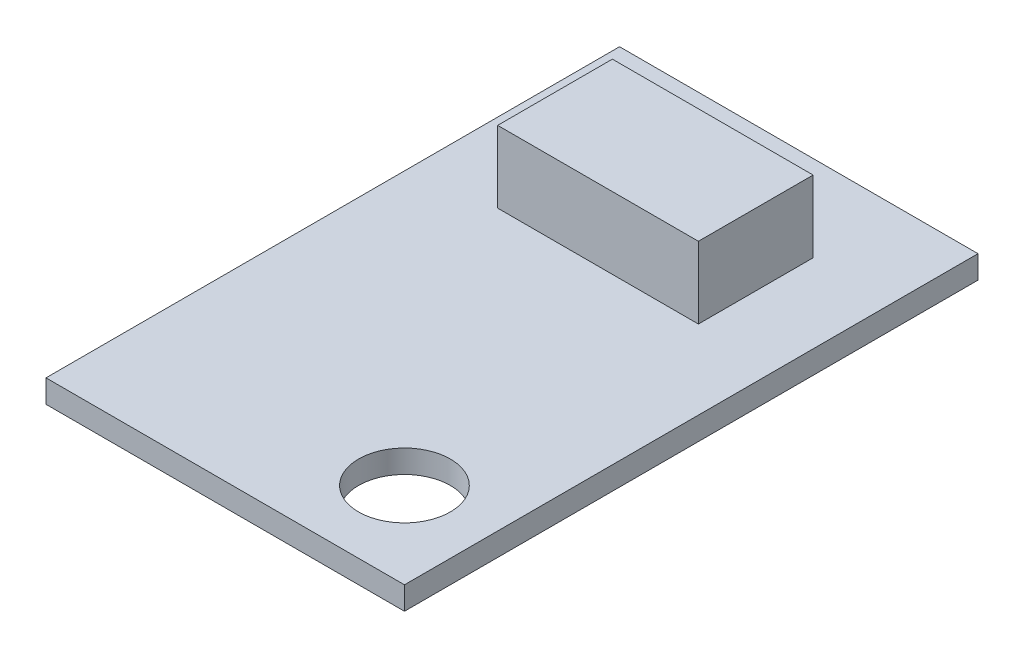
ISO-10303-21;
HEADER;
FILE_DESCRIPTION(('STEP AP214'),'2;1');
FILE_NAME('part.step','',(''),(''),'','','');
FILE_SCHEMA(('AUTOMOTIVE_DESIGN { 1 0 10303 214 1 1 1 1 }'));
ENDSEC;
DATA;
#1=APPLICATION_CONTEXT('core data for automotive mechanical design processes');
#2=APPLICATION_PROTOCOL_DEFINITION('international standard','automotive_design',2000,#1);
#3=PRODUCT_CONTEXT('',#1,'mechanical');
#4=PRODUCT('Part','Part','',(#3));
#5=PRODUCT_RELATED_PRODUCT_CATEGORY('part','',(#4));
#6=PRODUCT_DEFINITION_FORMATION('','',#4);
#7=PRODUCT_DEFINITION_CONTEXT('part definition',#1,'design');
#8=PRODUCT_DEFINITION('design','',#6,#7);
#9=PRODUCT_DEFINITION_SHAPE('','',#8);
#10=(LENGTH_UNIT() NAMED_UNIT(*) SI_UNIT(.MILLI.,.METRE.));
#11=(NAMED_UNIT(*) PLANE_ANGLE_UNIT() SI_UNIT($,.RADIAN.));
#12=(NAMED_UNIT(*) SI_UNIT($,.STERADIAN.) SOLID_ANGLE_UNIT());
#13=UNCERTAINTY_MEASURE_WITH_UNIT(LENGTH_MEASURE(1.E-05),#10,'distance_accuracy_value','');
#14=(GEOMETRIC_REPRESENTATION_CONTEXT(3) GLOBAL_UNCERTAINTY_ASSIGNED_CONTEXT((#13)) GLOBAL_UNIT_ASSIGNED_CONTEXT((#10,
#11,#12)) REPRESENTATION_CONTEXT('',''));
#15=CARTESIAN_POINT('',(0.,0.,0.));
#16=DIRECTION('',(0.,0.,1.));
#17=DIRECTION('',(1.,0.,0.));
#18=AXIS2_PLACEMENT_3D('',#15,#16,#17);
#19=CARTESIAN_POINT('',(0.,0.8,0.));
#20=DIRECTION('',(0.,-1.,0.));
#21=DIRECTION('',(0.,0.,-1.));
#22=AXIS2_PLACEMENT_3D('',#19,#20,#21);
#23=PLANE('',#22);
#24=CARTESIAN_POINT('',(3.25,0.8,-3.));
#25=DIRECTION('',(0.,1.,0.));
#26=DIRECTION('',(0.,0.,1.));
#27=AXIS2_PLACEMENT_3D('',#24,#25,#26);
#28=CIRCLE('',#27,1.6);
#29=CARTESIAN_POINT('',(3.25,0.8,-1.4));
#30=VERTEX_POINT('',#29);
#31=EDGE_CURVE('E124',#30,#30,#28,.T.);
#32=ORIENTED_EDGE('',*,*,#31,.F.);
#33=EDGE_LOOP('',(#32));
#34=FACE_BOUND('',#33,.T.);
#35=DIRECTION('',(0.,0.,1.));
#36=VECTOR('',#35,1.);
#37=CARTESIAN_POINT('',(-6.25,0.8,0.));
#38=LINE('',#37,#36);
#39=CARTESIAN_POINT('',(-6.25,0.8,-20.));
#40=VERTEX_POINT('',#39);
#41=CARTESIAN_POINT('',(-6.25,0.8,0.));
#42=VERTEX_POINT('',#41);
#43=EDGE_CURVE('E133',#40,#42,#38,.T.);
#44=ORIENTED_EDGE('',*,*,#43,.T.);
#45=DIRECTION('',(1.,0.,0.));
#46=VECTOR('',#45,1.);
#47=CARTESIAN_POINT('',(-6.25,0.8,0.));
#48=LINE('',#47,#46);
#49=CARTESIAN_POINT('',(6.25,0.8,0.));
#50=VERTEX_POINT('',#49);
#51=EDGE_CURVE('E136',#42,#50,#48,.T.);
#52=ORIENTED_EDGE('',*,*,#51,.T.);
#53=DIRECTION('',(0.,0.,-1.));
#54=VECTOR('',#53,1.);
#55=CARTESIAN_POINT('',(6.25,0.8,0.));
#56=LINE('',#55,#54);
#57=CARTESIAN_POINT('',(6.24999999999999,0.8,-20.));
#58=VERTEX_POINT('',#57);
#59=EDGE_CURVE('E139',#50,#58,#56,.T.);
#60=ORIENTED_EDGE('',*,*,#59,.T.);
#61=DIRECTION('',(-1.,0.,0.));
#62=VECTOR('',#61,1.);
#63=CARTESIAN_POINT('',(-6.25,0.8,-20.));
#64=LINE('',#63,#62);
#65=EDGE_CURVE('E141',#58,#40,#64,.T.);
#66=ORIENTED_EDGE('',*,*,#65,.T.);
#67=EDGE_LOOP('',(#44,#52,#60,#66));
#68=FACE_BOUND('',#67,.T.);
#69=DIRECTION('',(0.,0.,1.));
#70=VECTOR('',#69,1.);
#71=CARTESIAN_POINT('',(-3.5,0.8,-17.));
#72=LINE('',#71,#70);
#73=CARTESIAN_POINT('',(-3.5,0.8,-17.));
#74=VERTEX_POINT('',#73);
#75=CARTESIAN_POINT('',(-3.5,0.8,-13.));
#76=VERTEX_POINT('',#75);
#77=EDGE_CURVE('E120',#74,#76,#72,.T.);
#78=ORIENTED_EDGE('',*,*,#77,.F.);
#79=DIRECTION('',(-1.,0.,0.));
#80=VECTOR('',#79,1.);
#81=CARTESIAN_POINT('',(-3.5,0.8,-17.));
#82=LINE('',#81,#80);
#83=CARTESIAN_POINT('',(3.5,0.8,-17.));
#84=VERTEX_POINT('',#83);
#85=EDGE_CURVE('E117',#84,#74,#82,.T.);
#86=ORIENTED_EDGE('',*,*,#85,.F.);
#87=DIRECTION('',(0.,0.,-1.));
#88=VECTOR('',#87,1.);
#89=CARTESIAN_POINT('',(3.5,0.8,-17.));
#90=LINE('',#89,#88);
#91=CARTESIAN_POINT('',(3.5,0.8,-13.));
#92=VERTEX_POINT('',#91);
#93=EDGE_CURVE('E55',#92,#84,#90,.T.);
#94=ORIENTED_EDGE('',*,*,#93,.F.);
#95=DIRECTION('',(1.,0.,0.));
#96=VECTOR('',#95,1.);
#97=CARTESIAN_POINT('',(-3.5,0.8,-13.));
#98=LINE('',#97,#96);
#99=EDGE_CURVE('E50',#76,#92,#98,.T.);
#100=ORIENTED_EDGE('',*,*,#99,.F.);
#101=EDGE_LOOP('',(#78,#86,#94,#100));
#102=FACE_BOUND('',#101,.T.);
#103=ADVANCED_FACE('F35',(#34,#68,#102),#23,.F.);
#104=CARTESIAN_POINT('',(0.,0.,0.));
#105=DIRECTION('',(0.,-1.,0.));
#106=DIRECTION('',(0.,0.,-1.));
#107=AXIS2_PLACEMENT_3D('',#104,#105,#106);
#108=PLANE('',#107);
#109=DIRECTION('',(0.,0.,1.));
#110=VECTOR('',#109,1.);
#111=CARTESIAN_POINT('',(-6.25,0.,0.));
#112=LINE('',#111,#110);
#113=CARTESIAN_POINT('',(-6.25,0.,-20.));
#114=VERTEX_POINT('',#113);
#115=CARTESIAN_POINT('',(-6.25,0.,0.));
#116=VERTEX_POINT('',#115);
#117=EDGE_CURVE('E131',#114,#116,#112,.T.);
#118=ORIENTED_EDGE('',*,*,#117,.F.);
#119=DIRECTION('',(-1.,0.,0.));
#120=VECTOR('',#119,1.);
#121=CARTESIAN_POINT('',(-6.25,0.,-20.));
#122=LINE('',#121,#120);
#123=CARTESIAN_POINT('',(6.24999999999999,0.,-20.));
#124=VERTEX_POINT('',#123);
#125=EDGE_CURVE('E137',#124,#114,#122,.T.);
#126=ORIENTED_EDGE('',*,*,#125,.F.);
#127=DIRECTION('',(0.,0.,-1.));
#128=VECTOR('',#127,1.);
#129=CARTESIAN_POINT('',(6.25,0.,0.));
#130=LINE('',#129,#128);
#131=CARTESIAN_POINT('',(6.25,0.,0.));
#132=VERTEX_POINT('',#131);
#133=EDGE_CURVE('E148',#132,#124,#130,.T.);
#134=ORIENTED_EDGE('',*,*,#133,.F.);
#135=DIRECTION('',(1.,0.,0.));
#136=VECTOR('',#135,1.);
#137=CARTESIAN_POINT('',(-6.25,0.,0.));
#138=LINE('',#137,#136);
#139=EDGE_CURVE('E146',#116,#132,#138,.T.);
#140=ORIENTED_EDGE('',*,*,#139,.F.);
#141=EDGE_LOOP('',(#118,#126,#134,#140));
#142=FACE_BOUND('',#141,.T.);
#143=CARTESIAN_POINT('',(3.25,0.,-3.));
#144=DIRECTION('',(0.,1.,0.));
#145=DIRECTION('',(0.,0.,1.));
#146=AXIS2_PLACEMENT_3D('',#143,#144,#145);
#147=CIRCLE('',#146,1.6);
#148=CARTESIAN_POINT('',(3.25,0.,-1.4));
#149=VERTEX_POINT('',#148);
#150=EDGE_CURVE('E121',#149,#149,#147,.T.);
#151=ORIENTED_EDGE('',*,*,#150,.T.);
#152=EDGE_LOOP('',(#151));
#153=FACE_BOUND('',#152,.T.);
#154=ADVANCED_FACE('F166',(#142,#153),#108,.T.);
#155=CARTESIAN_POINT('',(-6.25,0.8,0.));
#156=DIRECTION('',(1.,0.,0.));
#157=DIRECTION('',(0.,0.,-1.));
#158=AXIS2_PLACEMENT_3D('',#155,#156,#157);
#159=PLANE('',#158);
#160=ORIENTED_EDGE('',*,*,#117,.T.);
#161=DIRECTION('',(0.,-1.,0.));
#162=VECTOR('',#161,1.);
#163=CARTESIAN_POINT('',(-6.25,0.8,0.));
#164=LINE('',#163,#162);
#165=EDGE_CURVE('E11',#42,#116,#164,.T.);
#166=ORIENTED_EDGE('',*,*,#165,.F.);
#167=ORIENTED_EDGE('',*,*,#43,.F.);
#168=DIRECTION('',(0.,-1.,0.));
#169=VECTOR('',#168,1.);
#170=CARTESIAN_POINT('',(-6.25,0.8,-20.));
#171=LINE('',#170,#169);
#172=EDGE_CURVE('E143',#40,#114,#171,.T.);
#173=ORIENTED_EDGE('',*,*,#172,.T.);
#174=EDGE_LOOP('',(#160,#166,#167,#173));
#175=FACE_BOUND('',#174,.T.);
#176=ADVANCED_FACE('F37',(#175),#159,.F.);
#177=CARTESIAN_POINT('',(-6.25,0.8,0.));
#178=DIRECTION('',(0.,0.,-1.));
#179=DIRECTION('',(-1.,0.,0.));
#180=AXIS2_PLACEMENT_3D('',#177,#178,#179);
#181=PLANE('',#180);
#182=ORIENTED_EDGE('',*,*,#139,.T.);
#183=DIRECTION('',(0.,-1.,0.));
#184=VECTOR('',#183,1.);
#185=CARTESIAN_POINT('',(6.25,0.8,0.));
#186=LINE('',#185,#184);
#187=EDGE_CURVE('E43',#50,#132,#186,.T.);
#188=ORIENTED_EDGE('',*,*,#187,.F.);
#189=ORIENTED_EDGE('',*,*,#51,.F.);
#190=ORIENTED_EDGE('',*,*,#165,.T.);
#191=EDGE_LOOP('',(#182,#188,#189,#190));
#192=FACE_BOUND('',#191,.T.);
#193=ADVANCED_FACE('F176',(#192),#181,.F.);
#194=CARTESIAN_POINT('',(6.25,0.8,0.));
#195=DIRECTION('',(-1.,0.,0.));
#196=DIRECTION('',(0.,0.,1.));
#197=AXIS2_PLACEMENT_3D('',#194,#195,#196);
#198=PLANE('',#197);
#199=ORIENTED_EDGE('',*,*,#133,.T.);
#200=DIRECTION('',(0.,-1.,0.));
#201=VECTOR('',#200,1.);
#202=CARTESIAN_POINT('',(6.24999999999999,0.8,-20.));
#203=LINE('',#202,#201);
#204=EDGE_CURVE('E153',#58,#124,#203,.T.);
#205=ORIENTED_EDGE('',*,*,#204,.F.);
#206=ORIENTED_EDGE('',*,*,#59,.F.);
#207=ORIENTED_EDGE('',*,*,#187,.T.);
#208=EDGE_LOOP('',(#199,#205,#206,#207));
#209=FACE_BOUND('',#208,.T.);
#210=ADVANCED_FACE('F160',(#209),#198,.F.);
#211=CARTESIAN_POINT('',(-6.25,0.8,-20.));
#212=DIRECTION('',(0.,0.,1.));
#213=DIRECTION('',(1.,0.,0.));
#214=AXIS2_PLACEMENT_3D('',#211,#212,#213);
#215=PLANE('',#214);
#216=ORIENTED_EDGE('',*,*,#125,.T.);
#217=ORIENTED_EDGE('',*,*,#172,.F.);
#218=ORIENTED_EDGE('',*,*,#65,.F.);
#219=ORIENTED_EDGE('',*,*,#204,.T.);
#220=EDGE_LOOP('',(#216,#217,#218,#219));
#221=FACE_BOUND('',#220,.T.);
#222=ADVANCED_FACE('F170',(#221),#215,.F.);
#223=CARTESIAN_POINT('',(3.25,0.8,-3.));
#224=DIRECTION('',(0.,-1.,0.));
#225=DIRECTION('',(0.,0.,-1.));
#226=AXIS2_PLACEMENT_3D('',#223,#224,#225);
#227=CYLINDRICAL_SURFACE('',#226,1.6);
#228=ORIENTED_EDGE('',*,*,#31,.T.);
#229=EDGE_LOOP('',(#228));
#230=FACE_BOUND('',#229,.T.);
#231=ORIENTED_EDGE('',*,*,#150,.F.);
#232=EDGE_LOOP('',(#231));
#233=FACE_BOUND('',#232,.T.);
#234=ADVANCED_FACE('F192',(#230,#233),#227,.F.);
#235=CARTESIAN_POINT('',(-3.5,3.3,-17.));
#236=DIRECTION('',(1.,0.,0.));
#237=DIRECTION('',(0.,0.,-1.));
#238=AXIS2_PLACEMENT_3D('',#235,#236,#237);
#239=PLANE('',#238);
#240=ORIENTED_EDGE('',*,*,#77,.T.);
#241=DIRECTION('',(0.,-1.,0.));
#242=VECTOR('',#241,1.);
#243=CARTESIAN_POINT('',(-3.5,3.3,-13.));
#244=LINE('',#243,#242);
#245=CARTESIAN_POINT('',(-3.5,3.3,-13.));
#246=VERTEX_POINT('',#245);
#247=EDGE_CURVE('E101',#246,#76,#244,.T.);
#248=ORIENTED_EDGE('',*,*,#247,.F.);
#249=DIRECTION('',(0.,0.,1.));
#250=VECTOR('',#249,1.);
#251=CARTESIAN_POINT('',(-3.5,3.3,-17.));
#252=LINE('',#251,#250);
#253=CARTESIAN_POINT('',(-3.5,3.3,-17.));
#254=VERTEX_POINT('',#253);
#255=EDGE_CURVE('E108',#254,#246,#252,.T.);
#256=ORIENTED_EDGE('',*,*,#255,.F.);
#257=DIRECTION('',(0.,-1.,0.));
#258=VECTOR('',#257,1.);
#259=CARTESIAN_POINT('',(-3.5,3.3,-17.));
#260=LINE('',#259,#258);
#261=EDGE_CURVE('E293',#254,#74,#260,.T.);
#262=ORIENTED_EDGE('',*,*,#261,.T.);
#263=EDGE_LOOP('',(#240,#248,#256,#262));
#264=FACE_BOUND('',#263,.T.);
#265=ADVANCED_FACE('F119',(#264),#239,.F.);
#266=CARTESIAN_POINT('',(-3.5,3.3,-13.));
#267=DIRECTION('',(0.,0.,-1.));
#268=DIRECTION('',(-1.,0.,0.));
#269=AXIS2_PLACEMENT_3D('',#266,#267,#268);
#270=PLANE('',#269);
#271=ORIENTED_EDGE('',*,*,#99,.T.);
#272=DIRECTION('',(0.,-1.,0.));
#273=VECTOR('',#272,1.);
#274=CARTESIAN_POINT('',(3.5,3.3,-13.));
#275=LINE('',#274,#273);
#276=CARTESIAN_POINT('',(3.5,3.3,-13.));
#277=VERTEX_POINT('',#276);
#278=EDGE_CURVE('E104',#277,#92,#275,.T.);
#279=ORIENTED_EDGE('',*,*,#278,.F.);
#280=DIRECTION('',(1.,0.,0.));
#281=VECTOR('',#280,1.);
#282=CARTESIAN_POINT('',(-3.5,3.3,-13.));
#283=LINE('',#282,#281);
#284=EDGE_CURVE('E97',#246,#277,#283,.T.);
#285=ORIENTED_EDGE('',*,*,#284,.F.);
#286=ORIENTED_EDGE('',*,*,#247,.T.);
#287=EDGE_LOOP('',(#271,#279,#285,#286));
#288=FACE_BOUND('',#287,.T.);
#289=ADVANCED_FACE('F99',(#288),#270,.F.);
#290=CARTESIAN_POINT('',(3.5,3.3,-17.));
#291=DIRECTION('',(-1.,0.,0.));
#292=DIRECTION('',(0.,0.,1.));
#293=AXIS2_PLACEMENT_3D('',#290,#291,#292);
#294=PLANE('',#293);
#295=ORIENTED_EDGE('',*,*,#93,.T.);
#296=DIRECTION('',(0.,-1.,0.));
#297=VECTOR('',#296,1.);
#298=CARTESIAN_POINT('',(3.5,3.3,-17.));
#299=LINE('',#298,#297);
#300=CARTESIAN_POINT('',(3.5,3.3,-17.));
#301=VERTEX_POINT('',#300);
#302=EDGE_CURVE('E126',#301,#84,#299,.T.);
#303=ORIENTED_EDGE('',*,*,#302,.F.);
#304=DIRECTION('',(0.,0.,-1.));
#305=VECTOR('',#304,1.);
#306=CARTESIAN_POINT('',(3.5,3.3,-17.));
#307=LINE('',#306,#305);
#308=EDGE_CURVE('E107',#277,#301,#307,.T.);
#309=ORIENTED_EDGE('',*,*,#308,.F.);
#310=ORIENTED_EDGE('',*,*,#278,.T.);
#311=EDGE_LOOP('',(#295,#303,#309,#310));
#312=FACE_BOUND('',#311,.T.);
#313=ADVANCED_FACE('F208',(#312),#294,.F.);
#314=CARTESIAN_POINT('',(-3.5,3.3,-17.));
#315=DIRECTION('',(0.,0.,1.));
#316=DIRECTION('',(1.,0.,0.));
#317=AXIS2_PLACEMENT_3D('',#314,#315,#316);
#318=PLANE('',#317);
#319=ORIENTED_EDGE('',*,*,#85,.T.);
#320=ORIENTED_EDGE('',*,*,#261,.F.);
#321=DIRECTION('',(-1.,0.,0.));
#322=VECTOR('',#321,1.);
#323=CARTESIAN_POINT('',(-3.5,3.3,-17.));
#324=LINE('',#323,#322);
#325=EDGE_CURVE('E113',#301,#254,#324,.T.);
#326=ORIENTED_EDGE('',*,*,#325,.F.);
#327=ORIENTED_EDGE('',*,*,#302,.T.);
#328=EDGE_LOOP('',(#319,#320,#326,#327));
#329=FACE_BOUND('',#328,.T.);
#330=ADVANCED_FACE('F213',(#329),#318,.F.);
#331=CARTESIAN_POINT('',(0.,3.3,0.));
#332=DIRECTION('',(0.,1.,0.));
#333=DIRECTION('',(0.,0.,1.));
#334=AXIS2_PLACEMENT_3D('',#331,#332,#333);
#335=PLANE('',#334);
#336=ORIENTED_EDGE('',*,*,#255,.T.);
#337=ORIENTED_EDGE('',*,*,#284,.T.);
#338=ORIENTED_EDGE('',*,*,#308,.T.);
#339=ORIENTED_EDGE('',*,*,#325,.T.);
#340=EDGE_LOOP('',(#336,#337,#338,#339));
#341=FACE_BOUND('',#340,.T.);
#342=ADVANCED_FACE('F111',(#341),#335,.T.);
#343=CLOSED_SHELL('',(#103,#154,#176,#193,#210,#222,#234,#265,#289,#313,#330,#342));
#344=MANIFOLD_SOLID_BREP('B2',#343);
#345=ADVANCED_BREP_SHAPE_REPRESENTATION('',(#18,#344),#14);
#346=SHAPE_DEFINITION_REPRESENTATION(#9,#345);
ENDSEC;
END-ISO-10303-21;
